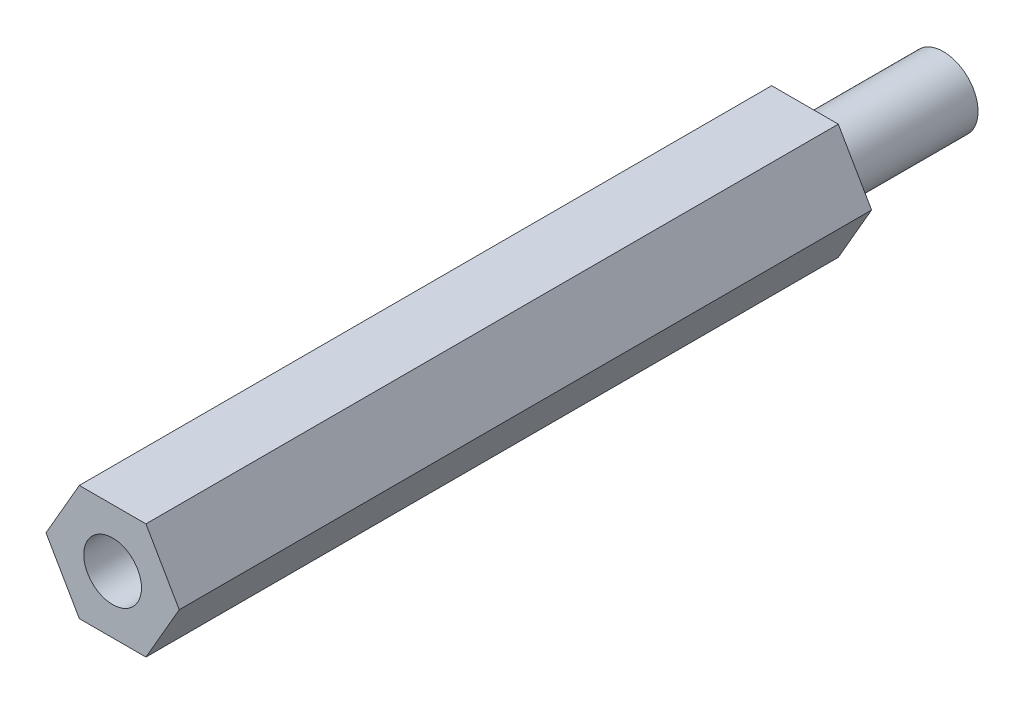
ISO-10303-21;
HEADER;
FILE_DESCRIPTION(('STEP AP214'),'2;1');
FILE_NAME('part.step','',(''),(''),'','','');
FILE_SCHEMA(('AUTOMOTIVE_DESIGN { 1 0 10303 214 1 1 1 1 }'));
ENDSEC;
DATA;
#1=APPLICATION_CONTEXT('core data for automotive mechanical design processes');
#2=APPLICATION_PROTOCOL_DEFINITION('international standard','automotive_design',2000,#1);
#3=PRODUCT_CONTEXT('',#1,'mechanical');
#4=PRODUCT('Part','Part','',(#3));
#5=PRODUCT_RELATED_PRODUCT_CATEGORY('part','',(#4));
#6=PRODUCT_DEFINITION_FORMATION('','',#4);
#7=PRODUCT_DEFINITION_CONTEXT('part definition',#1,'design');
#8=PRODUCT_DEFINITION('design','',#6,#7);
#9=PRODUCT_DEFINITION_SHAPE('','',#8);
#10=(LENGTH_UNIT() NAMED_UNIT(*) SI_UNIT(.MILLI.,.METRE.));
#11=(NAMED_UNIT(*) PLANE_ANGLE_UNIT() SI_UNIT($,.RADIAN.));
#12=(NAMED_UNIT(*) SI_UNIT($,.STERADIAN.) SOLID_ANGLE_UNIT());
#13=UNCERTAINTY_MEASURE_WITH_UNIT(LENGTH_MEASURE(1.E-05),#10,'distance_accuracy_value','');
#14=(GEOMETRIC_REPRESENTATION_CONTEXT(3) GLOBAL_UNCERTAINTY_ASSIGNED_CONTEXT((#13)) GLOBAL_UNIT_ASSIGNED_CONTEXT((#10,
#11,#12)) REPRESENTATION_CONTEXT('',''));
#15=CARTESIAN_POINT('',(0.,0.,0.));
#16=DIRECTION('',(0.,0.,1.));
#17=DIRECTION('',(1.,0.,0.));
#18=AXIS2_PLACEMENT_3D('',#15,#16,#17);
#19=CARTESIAN_POINT('',(1.44337567297406,2.5,30.));
#20=DIRECTION('',(0.,-1.,0.));
#21=DIRECTION('',(1.,0.,0.));
#22=AXIS2_PLACEMENT_3D('',#19,#20,#21);
#23=PLANE('',#22);
#24=DIRECTION('',(-1.,0.,0.));
#25=VECTOR('',#24,1.);
#26=CARTESIAN_POINT('',(1.44337567297406,2.5,0.));
#27=LINE('',#26,#25);
#28=CARTESIAN_POINT('',(1.44337567297406,2.5,0.));
#29=VERTEX_POINT('',#28);
#30=CARTESIAN_POINT('',(-1.44337567297407,2.5,0.));
#31=VERTEX_POINT('',#30);
#32=EDGE_CURVE('E121',#29,#31,#27,.T.);
#33=ORIENTED_EDGE('',*,*,#32,.T.);
#34=DIRECTION('',(0.,0.,-1.));
#35=VECTOR('',#34,1.);
#36=CARTESIAN_POINT('',(-1.44337567297407,2.5,30.));
#37=LINE('',#36,#35);
#38=CARTESIAN_POINT('',(-1.44337567297407,2.5,30.));
#39=VERTEX_POINT('',#38);
#40=EDGE_CURVE('E36',#39,#31,#37,.T.);
#41=ORIENTED_EDGE('',*,*,#40,.F.);
#42=DIRECTION('',(-1.,0.,0.));
#43=VECTOR('',#42,1.);
#44=CARTESIAN_POINT('',(1.44337567297406,2.5,30.));
#45=LINE('',#44,#43);
#46=CARTESIAN_POINT('',(1.44337567297406,2.5,30.));
#47=VERTEX_POINT('',#46);
#48=EDGE_CURVE('E132',#47,#39,#45,.T.);
#49=ORIENTED_EDGE('',*,*,#48,.F.);
#50=DIRECTION('',(0.,0.,-1.));
#51=VECTOR('',#50,1.);
#52=CARTESIAN_POINT('',(1.44337567297406,2.5,30.));
#53=LINE('',#52,#51);
#54=EDGE_CURVE('E117',#47,#29,#53,.T.);
#55=ORIENTED_EDGE('',*,*,#54,.T.);
#56=EDGE_LOOP('',(#33,#41,#49,#55));
#57=FACE_BOUND('',#56,.T.);
#58=ADVANCED_FACE('F33',(#57),#23,.F.);
#59=CARTESIAN_POINT('',(-1.44337567297407,2.5,30.));
#60=DIRECTION('',(0.866025403784439,-0.5,0.));
#61=DIRECTION('',(0.5,0.866025403784439,0.));
#62=AXIS2_PLACEMENT_3D('',#59,#60,#61);
#63=PLANE('',#62);
#64=DIRECTION('',(-0.5,-0.866025403784439,0.));
#65=VECTOR('',#64,1.);
#66=CARTESIAN_POINT('',(-1.44337567297407,2.5,0.));
#67=LINE('',#66,#65);
#68=CARTESIAN_POINT('',(-2.88675134594813,0.,0.));
#69=VERTEX_POINT('',#68);
#70=EDGE_CURVE('E124',#31,#69,#67,.T.);
#71=ORIENTED_EDGE('',*,*,#70,.T.);
#72=DIRECTION('',(0.,0.,-1.));
#73=VECTOR('',#72,1.);
#74=CARTESIAN_POINT('',(-2.88675134594813,0.,30.));
#75=LINE('',#74,#73);
#76=CARTESIAN_POINT('',(-2.88675134594813,0.,30.));
#77=VERTEX_POINT('',#76);
#78=EDGE_CURVE('E135',#77,#69,#75,.T.);
#79=ORIENTED_EDGE('',*,*,#78,.F.);
#80=DIRECTION('',(-0.5,-0.866025403784439,0.));
#81=VECTOR('',#80,1.);
#82=CARTESIAN_POINT('',(-1.44337567297407,2.5,30.));
#83=LINE('',#82,#81);
#84=EDGE_CURVE('E89',#39,#77,#83,.T.);
#85=ORIENTED_EDGE('',*,*,#84,.F.);
#86=ORIENTED_EDGE('',*,*,#40,.T.);
#87=EDGE_LOOP('',(#71,#79,#85,#86));
#88=FACE_BOUND('',#87,.T.);
#89=ADVANCED_FACE('F140',(#88),#63,.F.);
#90=CARTESIAN_POINT('',(-2.88675134594813,0.,30.));
#91=DIRECTION('',(0.866025403784438,0.5,0.));
#92=DIRECTION('',(-0.5,0.866025403784438,0.));
#93=AXIS2_PLACEMENT_3D('',#90,#91,#92);
#94=PLANE('',#93);
#95=DIRECTION('',(0.5,-0.866025403784438,0.));
#96=VECTOR('',#95,1.);
#97=CARTESIAN_POINT('',(-2.88675134594813,0.,0.));
#98=LINE('',#97,#96);
#99=CARTESIAN_POINT('',(-1.44337567297406,-2.5,0.));
#100=VERTEX_POINT('',#99);
#101=EDGE_CURVE('E127',#69,#100,#98,.T.);
#102=ORIENTED_EDGE('',*,*,#101,.T.);
#103=DIRECTION('',(0.,0.,-1.));
#104=VECTOR('',#103,1.);
#105=CARTESIAN_POINT('',(-1.44337567297406,-2.5,30.));
#106=LINE('',#105,#104);
#107=CARTESIAN_POINT('',(-1.44337567297406,-2.5,30.));
#108=VERTEX_POINT('',#107);
#109=EDGE_CURVE('E112',#108,#100,#106,.T.);
#110=ORIENTED_EDGE('',*,*,#109,.F.);
#111=DIRECTION('',(0.5,-0.866025403784438,0.));
#112=VECTOR('',#111,1.);
#113=CARTESIAN_POINT('',(-2.88675134594813,0.,30.));
#114=LINE('',#113,#112);
#115=EDGE_CURVE('E103',#77,#108,#114,.T.);
#116=ORIENTED_EDGE('',*,*,#115,.F.);
#117=ORIENTED_EDGE('',*,*,#78,.T.);
#118=EDGE_LOOP('',(#102,#110,#116,#117));
#119=FACE_BOUND('',#118,.T.);
#120=ADVANCED_FACE('F146',(#119),#94,.F.);
#121=CARTESIAN_POINT('',(-1.44337567297406,-2.5,30.));
#122=DIRECTION('',(0.,1.,0.));
#123=DIRECTION('',(-1.,0.,0.));
#124=AXIS2_PLACEMENT_3D('',#121,#122,#123);
#125=PLANE('',#124);
#126=DIRECTION('',(1.,0.,0.));
#127=VECTOR('',#126,1.);
#128=CARTESIAN_POINT('',(-1.44337567297406,-2.5,0.));
#129=LINE('',#128,#127);
#130=CARTESIAN_POINT('',(1.44337567297407,-2.5,0.));
#131=VERTEX_POINT('',#130);
#132=EDGE_CURVE('E111',#100,#131,#129,.T.);
#133=ORIENTED_EDGE('',*,*,#132,.T.);
#134=DIRECTION('',(0.,0.,-1.));
#135=VECTOR('',#134,1.);
#136=CARTESIAN_POINT('',(1.44337567297407,-2.5,30.));
#137=LINE('',#136,#135);
#138=CARTESIAN_POINT('',(1.44337567297407,-2.5,30.));
#139=VERTEX_POINT('',#138);
#140=EDGE_CURVE('E108',#139,#131,#137,.T.);
#141=ORIENTED_EDGE('',*,*,#140,.F.);
#142=DIRECTION('',(1.,0.,0.));
#143=VECTOR('',#142,1.);
#144=CARTESIAN_POINT('',(-1.44337567297406,-2.5,30.));
#145=LINE('',#144,#143);
#146=EDGE_CURVE('E97',#108,#139,#145,.T.);
#147=ORIENTED_EDGE('',*,*,#146,.F.);
#148=ORIENTED_EDGE('',*,*,#109,.T.);
#149=EDGE_LOOP('',(#133,#141,#147,#148));
#150=FACE_BOUND('',#149,.T.);
#151=ADVANCED_FACE('F109',(#150),#125,.F.);
#152=CARTESIAN_POINT('',(1.44337567297407,-2.5,30.));
#153=DIRECTION('',(-0.866025403784439,0.5,0.));
#154=DIRECTION('',(-0.5,-0.866025403784439,0.));
#155=AXIS2_PLACEMENT_3D('',#152,#153,#154);
#156=PLANE('',#155);
#157=DIRECTION('',(0.5,0.866025403784439,0.));
#158=VECTOR('',#157,1.);
#159=CARTESIAN_POINT('',(1.44337567297407,-2.5,0.));
#160=LINE('',#159,#158);
#161=CARTESIAN_POINT('',(2.88675134594813,0.,0.));
#162=VERTEX_POINT('',#161);
#163=EDGE_CURVE('E74',#131,#162,#160,.T.);
#164=ORIENTED_EDGE('',*,*,#163,.T.);
#165=DIRECTION('',(0.,0.,-1.));
#166=VECTOR('',#165,1.);
#167=CARTESIAN_POINT('',(2.88675134594813,0.,30.));
#168=LINE('',#167,#166);
#169=CARTESIAN_POINT('',(2.88675134594813,0.,30.));
#170=VERTEX_POINT('',#169);
#171=EDGE_CURVE('E113',#170,#162,#168,.T.);
#172=ORIENTED_EDGE('',*,*,#171,.F.);
#173=DIRECTION('',(0.5,0.866025403784439,0.));
#174=VECTOR('',#173,1.);
#175=CARTESIAN_POINT('',(1.44337567297407,-2.5,30.));
#176=LINE('',#175,#174);
#177=EDGE_CURVE('E101',#139,#170,#176,.T.);
#178=ORIENTED_EDGE('',*,*,#177,.F.);
#179=ORIENTED_EDGE('',*,*,#140,.T.);
#180=EDGE_LOOP('',(#164,#172,#178,#179));
#181=FACE_BOUND('',#180,.T.);
#182=ADVANCED_FACE('F115',(#181),#156,.F.);
#183=CARTESIAN_POINT('',(2.88675134594813,0.,30.));
#184=DIRECTION('',(-0.866025403784438,-0.5,0.));
#185=DIRECTION('',(0.5,-0.866025403784439,0.));
#186=AXIS2_PLACEMENT_3D('',#183,#184,#185);
#187=PLANE('',#186);
#188=DIRECTION('',(-0.5,0.866025403784439,0.));
#189=VECTOR('',#188,1.);
#190=CARTESIAN_POINT('',(2.88675134594813,0.,0.));
#191=LINE('',#190,#189);
#192=EDGE_CURVE('E80',#162,#29,#191,.T.);
#193=ORIENTED_EDGE('',*,*,#192,.T.);
#194=ORIENTED_EDGE('',*,*,#54,.F.);
#195=DIRECTION('',(-0.5,0.866025403784439,0.));
#196=VECTOR('',#195,1.);
#197=CARTESIAN_POINT('',(2.88675134594813,0.,30.));
#198=LINE('',#197,#196);
#199=EDGE_CURVE('E50',#170,#47,#198,.T.);
#200=ORIENTED_EDGE('',*,*,#199,.F.);
#201=ORIENTED_EDGE('',*,*,#171,.T.);
#202=EDGE_LOOP('',(#193,#194,#200,#201));
#203=FACE_BOUND('',#202,.T.);
#204=ADVANCED_FACE('F162',(#203),#187,.F.);
#205=CARTESIAN_POINT('',(0.,0.,30.));
#206=DIRECTION('',(0.,0.,1.));
#207=DIRECTION('',(1.,0.,0.));
#208=AXIS2_PLACEMENT_3D('',#205,#206,#207);
#209=PLANE('',#208);
#210=CARTESIAN_POINT('',(0.,0.,30.));
#211=DIRECTION('',(0.,0.,1.));
#212=DIRECTION('',(1.,0.,0.));
#213=AXIS2_PLACEMENT_3D('',#210,#211,#212);
#214=CIRCLE('',#213,1.24999999999999);
#215=CARTESIAN_POINT('',(1.24999999999999,0.,30.));
#216=VERTEX_POINT('',#215);
#217=EDGE_CURVE('E155',#216,#216,#214,.T.);
#218=ORIENTED_EDGE('',*,*,#217,.F.);
#219=EDGE_LOOP('',(#218));
#220=FACE_BOUND('',#219,.T.);
#221=ORIENTED_EDGE('',*,*,#48,.T.);
#222=ORIENTED_EDGE('',*,*,#84,.T.);
#223=ORIENTED_EDGE('',*,*,#115,.T.);
#224=ORIENTED_EDGE('',*,*,#146,.T.);
#225=ORIENTED_EDGE('',*,*,#177,.T.);
#226=ORIENTED_EDGE('',*,*,#199,.T.);
#227=EDGE_LOOP('',(#221,#222,#223,#224,#225,#226));
#228=FACE_BOUND('',#227,.T.);
#229=ADVANCED_FACE('F99',(#220,#228),#209,.T.);
#230=CARTESIAN_POINT('',(0.,0.,0.));
#231=DIRECTION('',(0.,0.,1.));
#232=DIRECTION('',(1.,0.,0.));
#233=AXIS2_PLACEMENT_3D('',#230,#231,#232);
#234=PLANE('',#233);
#235=CARTESIAN_POINT('',(0.,0.,0.));
#236=DIRECTION('',(0.,0.,-1.));
#237=DIRECTION('',(-1.,0.,0.));
#238=AXIS2_PLACEMENT_3D('',#235,#236,#237);
#239=CIRCLE('',#238,1.5);
#240=CARTESIAN_POINT('',(-1.5,0.,0.));
#241=VERTEX_POINT('',#240);
#242=EDGE_CURVE('E11',#241,#241,#239,.T.);
#243=ORIENTED_EDGE('',*,*,#242,.F.);
#244=EDGE_LOOP('',(#243));
#245=FACE_BOUND('',#244,.T.);
#246=ORIENTED_EDGE('',*,*,#32,.F.);
#247=ORIENTED_EDGE('',*,*,#192,.F.);
#248=ORIENTED_EDGE('',*,*,#163,.F.);
#249=ORIENTED_EDGE('',*,*,#132,.F.);
#250=ORIENTED_EDGE('',*,*,#101,.F.);
#251=ORIENTED_EDGE('',*,*,#70,.F.);
#252=EDGE_LOOP('',(#246,#247,#248,#249,#250,#251));
#253=FACE_BOUND('',#252,.T.);
#254=ADVANCED_FACE('F145',(#245,#253),#234,.F.);
#255=CARTESIAN_POINT('',(0.,0.,-6.));
#256=DIRECTION('',(0.,0.,1.));
#257=DIRECTION('',(1.,0.,0.));
#258=AXIS2_PLACEMENT_3D('',#255,#256,#257);
#259=CYLINDRICAL_SURFACE('',#258,1.5);
#260=CARTESIAN_POINT('',(0.,0.,-6.));
#261=DIRECTION('',(0.,0.,-1.));
#262=DIRECTION('',(-1.,0.,0.));
#263=AXIS2_PLACEMENT_3D('',#260,#261,#262);
#264=CIRCLE('',#263,1.5);
#265=CARTESIAN_POINT('',(-1.5,0.,-6.));
#266=VERTEX_POINT('',#265);
#267=EDGE_CURVE('E125',#266,#266,#264,.T.);
#268=ORIENTED_EDGE('',*,*,#267,.F.);
#269=EDGE_LOOP('',(#268));
#270=FACE_BOUND('',#269,.T.);
#271=ORIENTED_EDGE('',*,*,#242,.T.);
#272=EDGE_LOOP('',(#271));
#273=FACE_BOUND('',#272,.T.);
#274=ADVANCED_FACE('F168',(#270,#273),#259,.T.);
#275=CARTESIAN_POINT('',(0.,0.,-6.));
#276=DIRECTION('',(0.,0.,-1.));
#277=DIRECTION('',(-1.,0.,0.));
#278=AXIS2_PLACEMENT_3D('',#275,#276,#277);
#279=PLANE('',#278);
#280=ORIENTED_EDGE('',*,*,#267,.T.);
#281=EDGE_LOOP('',(#280));
#282=FACE_BOUND('',#281,.T.);
#283=ADVANCED_FACE('F209',(#282),#279,.T.);
#284=CARTESIAN_POINT('',(0.,0.,22.5));
#285=DIRECTION('',(0.,0.,1.));
#286=DIRECTION('',(1.,0.,0.));
#287=AXIS2_PLACEMENT_3D('',#284,#285,#286);
#288=CONICAL_SURFACE('',#287,1.25,1.02974425867665);
#289=CARTESIAN_POINT('',(0.,0.,21.7489242262155));
#290=VERTEX_POINT('',#289);
#291=VERTEX_LOOP('',#290);
#292=FACE_BOUND('',#291,.T.);
#293=CARTESIAN_POINT('',(0.,0.,22.5));
#294=DIRECTION('',(0.,0.,1.));
#295=DIRECTION('',(1.,0.,0.));
#296=AXIS2_PLACEMENT_3D('',#293,#294,#295);
#297=CIRCLE('',#296,1.25);
#298=CARTESIAN_POINT('',(1.25,0.,22.5));
#299=VERTEX_POINT('',#298);
#300=EDGE_CURVE('E152',#299,#299,#297,.T.);
#301=ORIENTED_EDGE('',*,*,#300,.T.);
#302=EDGE_LOOP('',(#301));
#303=FACE_BOUND('',#302,.T.);
#304=ADVANCED_FACE('F217',(#292,#303),#288,.F.);
#305=CARTESIAN_POINT('',(0.,0.,30.));
#306=DIRECTION('',(0.,0.,1.));
#307=DIRECTION('',(1.,0.,0.));
#308=AXIS2_PLACEMENT_3D('',#305,#306,#307);
#309=CYLINDRICAL_SURFACE('',#308,1.24999999999999);
#310=ORIENTED_EDGE('',*,*,#300,.F.);
#311=EDGE_LOOP('',(#310));
#312=FACE_BOUND('',#311,.T.);
#313=ORIENTED_EDGE('',*,*,#217,.T.);
#314=EDGE_LOOP('',(#313));
#315=FACE_BOUND('',#314,.T.);
#316=ADVANCED_FACE('F159',(#312,#315),#309,.F.);
#317=CLOSED_SHELL('',(#58,#89,#120,#151,#182,#204,#229,#254,#274,#283,#304,#316));
#318=MANIFOLD_SOLID_BREP('B2',#317);
#319=ADVANCED_BREP_SHAPE_REPRESENTATION('',(#18,#318),#14);
#320=SHAPE_DEFINITION_REPRESENTATION(#9,#319);
ENDSEC;
END-ISO-10303-21;
